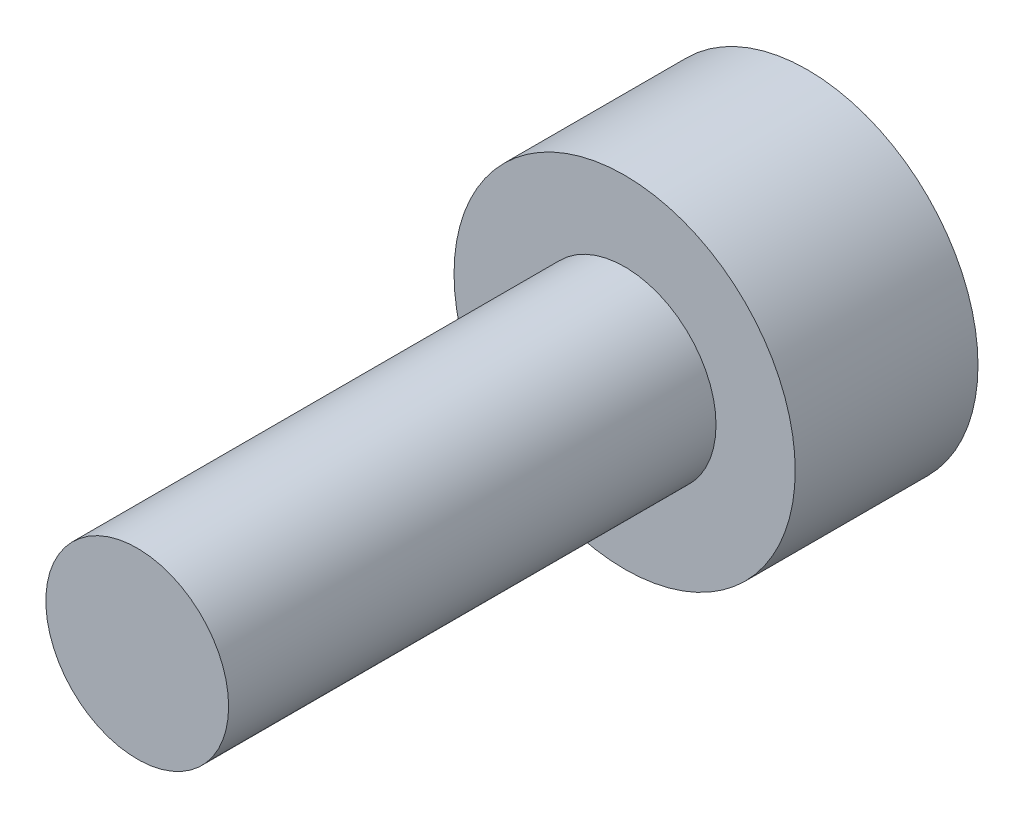
ISO-10303-21;
HEADER;
FILE_DESCRIPTION(('STEP AP214'),'2;1');
FILE_NAME('part.step','',(''),(''),'','','');
FILE_SCHEMA(('AUTOMOTIVE_DESIGN { 1 0 10303 214 1 1 1 1 }'));
ENDSEC;
DATA;
#1=APPLICATION_CONTEXT('core data for automotive mechanical design processes');
#2=APPLICATION_PROTOCOL_DEFINITION('international standard','automotive_design',2000,#1);
#3=PRODUCT_CONTEXT('',#1,'mechanical');
#4=PRODUCT('Part','Part','',(#3));
#5=PRODUCT_RELATED_PRODUCT_CATEGORY('part','',(#4));
#6=PRODUCT_DEFINITION_FORMATION('','',#4);
#7=PRODUCT_DEFINITION_CONTEXT('part definition',#1,'design');
#8=PRODUCT_DEFINITION('design','',#6,#7);
#9=PRODUCT_DEFINITION_SHAPE('','',#8);
#10=(LENGTH_UNIT() NAMED_UNIT(*) SI_UNIT(.MILLI.,.METRE.));
#11=(NAMED_UNIT(*) PLANE_ANGLE_UNIT() SI_UNIT($,.RADIAN.));
#12=(NAMED_UNIT(*) SI_UNIT($,.STERADIAN.) SOLID_ANGLE_UNIT());
#13=UNCERTAINTY_MEASURE_WITH_UNIT(LENGTH_MEASURE(1.E-05),#10,'distance_accuracy_value','');
#14=(GEOMETRIC_REPRESENTATION_CONTEXT(3) GLOBAL_UNCERTAINTY_ASSIGNED_CONTEXT((#13)) GLOBAL_UNIT_ASSIGNED_CONTEXT((#10,
#11,#12)) REPRESENTATION_CONTEXT('',''));
#15=CARTESIAN_POINT('',(0.,0.,0.));
#16=DIRECTION('',(0.,0.,1.));
#17=DIRECTION('',(1.,0.,0.));
#18=AXIS2_PLACEMENT_3D('',#15,#16,#17);
#19=CARTESIAN_POINT('',(0.,0.,-3.));
#20=DIRECTION('',(0.,0.,1.));
#21=DIRECTION('',(1.,0.,0.));
#22=AXIS2_PLACEMENT_3D('',#19,#20,#21);
#23=PLANE('',#22);
#24=CARTESIAN_POINT('',(0.,0.,-3.));
#25=DIRECTION('',(0.,0.,1.));
#26=DIRECTION('',(1.,0.,0.));
#27=AXIS2_PLACEMENT_3D('',#24,#25,#26);
#28=CIRCLE('',#27,2.8);
#29=CARTESIAN_POINT('',(2.8,0.,-3.));
#30=VERTEX_POINT('',#29);
#31=EDGE_CURVE('E112',#30,#30,#28,.T.);
#32=ORIENTED_EDGE('',*,*,#31,.F.);
#33=EDGE_LOOP('',(#32));
#34=FACE_BOUND('',#33,.T.);
#35=DIRECTION('',(0.,-1.,0.));
#36=VECTOR('',#35,1.);
#37=CARTESIAN_POINT('',(1.25,0.,-3.));
#38=LINE('',#37,#36);
#39=CARTESIAN_POINT('',(1.25,0.721687836487032,-3.));
#40=VERTEX_POINT('',#39);
#41=CARTESIAN_POINT('',(1.25,-0.721687836487033,-3.));
#42=VERTEX_POINT('',#41);
#43=EDGE_CURVE('E11',#40,#42,#38,.T.);
#44=ORIENTED_EDGE('',*,*,#43,.F.);
#45=DIRECTION('',(0.866025403784439,-0.5,0.));
#46=VECTOR('',#45,1.);
#47=CARTESIAN_POINT('',(0.625,1.08253175473055,-3.));
#48=LINE('',#47,#46);
#49=CARTESIAN_POINT('',(0.,1.44337567297406,-3.));
#50=VERTEX_POINT('',#49);
#51=EDGE_CURVE('E50',#50,#40,#48,.T.);
#52=ORIENTED_EDGE('',*,*,#51,.F.);
#53=DIRECTION('',(0.866025403784439,0.5,0.));
#54=VECTOR('',#53,1.);
#55=CARTESIAN_POINT('',(-0.625,1.08253175473055,-3.));
#56=LINE('',#55,#54);
#57=CARTESIAN_POINT('',(-1.25,0.721687836487032,-3.));
#58=VERTEX_POINT('',#57);
#59=EDGE_CURVE('E132',#58,#50,#56,.T.);
#60=ORIENTED_EDGE('',*,*,#59,.F.);
#61=DIRECTION('',(0.,1.,0.));
#62=VECTOR('',#61,1.);
#63=CARTESIAN_POINT('',(-1.25,0.,-3.));
#64=LINE('',#63,#62);
#65=CARTESIAN_POINT('',(-1.25,-0.721687836487032,-3.));
#66=VERTEX_POINT('',#65);
#67=EDGE_CURVE('E129',#66,#58,#64,.T.);
#68=ORIENTED_EDGE('',*,*,#67,.F.);
#69=DIRECTION('',(-0.866025403784439,0.5,0.));
#70=VECTOR('',#69,1.);
#71=CARTESIAN_POINT('',(-0.625,-1.08253175473055,-3.));
#72=LINE('',#71,#70);
#73=CARTESIAN_POINT('',(0.,-1.44337567297406,-3.));
#74=VERTEX_POINT('',#73);
#75=EDGE_CURVE('E130',#74,#66,#72,.T.);
#76=ORIENTED_EDGE('',*,*,#75,.F.);
#77=DIRECTION('',(-0.866025403784439,-0.5,0.));
#78=VECTOR('',#77,1.);
#79=CARTESIAN_POINT('',(0.624999999999999,-1.08253175473055,-3.));
#80=LINE('',#79,#78);
#81=EDGE_CURVE('E118',#42,#74,#80,.T.);
#82=ORIENTED_EDGE('',*,*,#81,.F.);
#83=EDGE_LOOP('',(#44,#52,#60,#68,#76,#82));
#84=FACE_BOUND('',#83,.T.);
#85=ADVANCED_FACE('F39',(#34,#84),#23,.F.);
#86=CARTESIAN_POINT('',(0.,0.,0.));
#87=DIRECTION('',(0.,0.,-1.));
#88=DIRECTION('',(-1.,0.,0.));
#89=AXIS2_PLACEMENT_3D('',#86,#87,#88);
#90=CYLINDRICAL_SURFACE('',#89,2.8);
#91=CARTESIAN_POINT('',(0.,0.,0.));
#92=DIRECTION('',(0.,0.,1.));
#93=DIRECTION('',(1.,0.,0.));
#94=AXIS2_PLACEMENT_3D('',#91,#92,#93);
#95=CIRCLE('',#94,2.8);
#96=CARTESIAN_POINT('',(2.8,0.,0.));
#97=VERTEX_POINT('',#96);
#98=EDGE_CURVE('E122',#97,#97,#95,.T.);
#99=ORIENTED_EDGE('',*,*,#98,.F.);
#100=EDGE_LOOP('',(#99));
#101=FACE_BOUND('',#100,.T.);
#102=ORIENTED_EDGE('',*,*,#31,.T.);
#103=EDGE_LOOP('',(#102));
#104=FACE_BOUND('',#103,.T.);
#105=ADVANCED_FACE('F41',(#101,#104),#90,.T.);
#106=CARTESIAN_POINT('',(0.,0.,0.));
#107=DIRECTION('',(0.,0.,1.));
#108=DIRECTION('',(1.,0.,0.));
#109=AXIS2_PLACEMENT_3D('',#106,#107,#108);
#110=PLANE('',#109);
#111=CARTESIAN_POINT('',(0.,0.,0.));
#112=DIRECTION('',(0.,0.,1.));
#113=DIRECTION('',(1.,0.,0.));
#114=AXIS2_PLACEMENT_3D('',#111,#112,#113);
#115=CIRCLE('',#114,1.5);
#116=CARTESIAN_POINT('',(1.5,0.,0.));
#117=VERTEX_POINT('',#116);
#118=EDGE_CURVE('E120',#117,#117,#115,.T.);
#119=ORIENTED_EDGE('',*,*,#118,.F.);
#120=EDGE_LOOP('',(#119));
#121=FACE_BOUND('',#120,.T.);
#122=ORIENTED_EDGE('',*,*,#98,.T.);
#123=EDGE_LOOP('',(#122));
#124=FACE_BOUND('',#123,.T.);
#125=ADVANCED_FACE('F179',(#121,#124),#110,.T.);
#126=CARTESIAN_POINT('',(0.,0.,8.));
#127=DIRECTION('',(0.,0.,-1.));
#128=DIRECTION('',(-1.,0.,0.));
#129=AXIS2_PLACEMENT_3D('',#126,#127,#128);
#130=CYLINDRICAL_SURFACE('',#129,1.5);
#131=CARTESIAN_POINT('',(0.,0.,8.));
#132=DIRECTION('',(0.,0.,1.));
#133=DIRECTION('',(1.,0.,0.));
#134=AXIS2_PLACEMENT_3D('',#131,#132,#133);
#135=CIRCLE('',#134,1.5);
#136=CARTESIAN_POINT('',(1.5,0.,8.));
#137=VERTEX_POINT('',#136);
#138=EDGE_CURVE('E110',#137,#137,#135,.T.);
#139=ORIENTED_EDGE('',*,*,#138,.F.);
#140=EDGE_LOOP('',(#139));
#141=FACE_BOUND('',#140,.T.);
#142=ORIENTED_EDGE('',*,*,#118,.T.);
#143=EDGE_LOOP('',(#142));
#144=FACE_BOUND('',#143,.T.);
#145=ADVANCED_FACE('F184',(#141,#144),#130,.T.);
#146=CARTESIAN_POINT('',(0.,0.,8.));
#147=DIRECTION('',(0.,0.,1.));
#148=DIRECTION('',(1.,0.,0.));
#149=AXIS2_PLACEMENT_3D('',#146,#147,#148);
#150=PLANE('',#149);
#151=ORIENTED_EDGE('',*,*,#138,.T.);
#152=EDGE_LOOP('',(#151));
#153=FACE_BOUND('',#152,.T.);
#154=ADVANCED_FACE('F189',(#153),#150,.T.);
#155=CARTESIAN_POINT('',(1.25,-0.721687836487033,-1.4));
#156=DIRECTION('',(-1.,0.,0.));
#157=DIRECTION('',(0.,-1.,0.));
#158=AXIS2_PLACEMENT_3D('',#155,#156,#157);
#159=PLANE('',#158);
#160=ORIENTED_EDGE('',*,*,#43,.T.);
#161=DIRECTION('',(0.,0.,-1.));
#162=VECTOR('',#161,1.);
#163=CARTESIAN_POINT('',(1.25,-0.721687836487033,-1.4));
#164=LINE('',#163,#162);
#165=CARTESIAN_POINT('',(1.25,-0.721687836487033,-1.4));
#166=VERTEX_POINT('',#165);
#167=EDGE_CURVE('E53',#166,#42,#164,.T.);
#168=ORIENTED_EDGE('',*,*,#167,.F.);
#169=DIRECTION('',(0.,1.,0.));
#170=VECTOR('',#169,1.);
#171=CARTESIAN_POINT('',(1.25,-0.721687836487033,-1.4));
#172=LINE('',#171,#170);
#173=CARTESIAN_POINT('',(1.25,0.721687836487032,-1.4));
#174=VERTEX_POINT('',#173);
#175=EDGE_CURVE('E96',#166,#174,#172,.T.);
#176=ORIENTED_EDGE('',*,*,#175,.T.);
#177=DIRECTION('',(0.,0.,-1.));
#178=VECTOR('',#177,1.);
#179=CARTESIAN_POINT('',(1.25,0.721687836487032,-1.4));
#180=LINE('',#179,#178);
#181=EDGE_CURVE('E103',#174,#40,#180,.T.);
#182=ORIENTED_EDGE('',*,*,#181,.T.);
#183=EDGE_LOOP('',(#160,#168,#176,#182));
#184=FACE_BOUND('',#183,.T.);
#185=ADVANCED_FACE('F105',(#184),#159,.T.);
#186=CARTESIAN_POINT('',(1.25,0.721687836487032,-1.4));
#187=DIRECTION('',(-0.5,-0.866025403784439,0.));
#188=DIRECTION('',(0.866025403784439,-0.5,0.));
#189=AXIS2_PLACEMENT_3D('',#186,#187,#188);
#190=PLANE('',#189);
#191=ORIENTED_EDGE('',*,*,#51,.T.);
#192=ORIENTED_EDGE('',*,*,#181,.F.);
#193=DIRECTION('',(-0.866025403784439,0.5,0.));
#194=VECTOR('',#193,1.);
#195=CARTESIAN_POINT('',(1.25,0.721687836487032,-1.4));
#196=LINE('',#195,#194);
#197=CARTESIAN_POINT('',(0.,1.44337567297406,-1.4));
#198=VERTEX_POINT('',#197);
#199=EDGE_CURVE('E95',#174,#198,#196,.T.);
#200=ORIENTED_EDGE('',*,*,#199,.T.);
#201=DIRECTION('',(0.,0.,-1.));
#202=VECTOR('',#201,1.);
#203=CARTESIAN_POINT('',(0.,1.44337567297406,-1.4));
#204=LINE('',#203,#202);
#205=EDGE_CURVE('E107',#198,#50,#204,.T.);
#206=ORIENTED_EDGE('',*,*,#205,.T.);
#207=EDGE_LOOP('',(#191,#192,#200,#206));
#208=FACE_BOUND('',#207,.T.);
#209=ADVANCED_FACE('F106',(#208),#190,.T.);
#210=CARTESIAN_POINT('',(0.,1.44337567297406,-1.4));
#211=DIRECTION('',(0.5,-0.866025403784439,0.));
#212=DIRECTION('',(0.866025403784439,0.5,0.));
#213=AXIS2_PLACEMENT_3D('',#210,#211,#212);
#214=PLANE('',#213);
#215=ORIENTED_EDGE('',*,*,#59,.T.);
#216=ORIENTED_EDGE('',*,*,#205,.F.);
#217=DIRECTION('',(-0.866025403784439,-0.5,0.));
#218=VECTOR('',#217,1.);
#219=CARTESIAN_POINT('',(0.,1.44337567297406,-1.4));
#220=LINE('',#219,#218);
#221=CARTESIAN_POINT('',(-1.25,0.721687836487032,-1.4));
#222=VERTEX_POINT('',#221);
#223=EDGE_CURVE('E98',#198,#222,#220,.T.);
#224=ORIENTED_EDGE('',*,*,#223,.T.);
#225=DIRECTION('',(0.,0.,-1.));
#226=VECTOR('',#225,1.);
#227=CARTESIAN_POINT('',(-1.25,0.721687836487032,-1.4));
#228=LINE('',#227,#226);
#229=EDGE_CURVE('E114',#222,#58,#228,.T.);
#230=ORIENTED_EDGE('',*,*,#229,.T.);
#231=EDGE_LOOP('',(#215,#216,#224,#230));
#232=FACE_BOUND('',#231,.T.);
#233=ADVANCED_FACE('F133',(#232),#214,.T.);
#234=CARTESIAN_POINT('',(-1.25,0.721687836487032,-1.4));
#235=DIRECTION('',(1.,0.,0.));
#236=DIRECTION('',(0.,1.,0.));
#237=AXIS2_PLACEMENT_3D('',#234,#235,#236);
#238=PLANE('',#237);
#239=ORIENTED_EDGE('',*,*,#67,.T.);
#240=ORIENTED_EDGE('',*,*,#229,.F.);
#241=DIRECTION('',(0.,-1.,0.));
#242=VECTOR('',#241,1.);
#243=CARTESIAN_POINT('',(-1.25,0.721687836487032,-1.4));
#244=LINE('',#243,#242);
#245=CARTESIAN_POINT('',(-1.25,-0.721687836487032,-1.4));
#246=VERTEX_POINT('',#245);
#247=EDGE_CURVE('E157',#222,#246,#244,.T.);
#248=ORIENTED_EDGE('',*,*,#247,.T.);
#249=DIRECTION('',(0.,0.,-1.));
#250=VECTOR('',#249,1.);
#251=CARTESIAN_POINT('',(-1.25,-0.721687836487032,-1.4));
#252=LINE('',#251,#250);
#253=EDGE_CURVE('E151',#246,#66,#252,.T.);
#254=ORIENTED_EDGE('',*,*,#253,.T.);
#255=EDGE_LOOP('',(#239,#240,#248,#254));
#256=FACE_BOUND('',#255,.T.);
#257=ADVANCED_FACE('F165',(#256),#238,.T.);
#258=CARTESIAN_POINT('',(-1.25,-0.721687836487032,-1.4));
#259=DIRECTION('',(0.5,0.866025403784439,0.));
#260=DIRECTION('',(-0.866025403784439,0.5,0.));
#261=AXIS2_PLACEMENT_3D('',#258,#259,#260);
#262=PLANE('',#261);
#263=ORIENTED_EDGE('',*,*,#75,.T.);
#264=ORIENTED_EDGE('',*,*,#253,.F.);
#265=DIRECTION('',(0.866025403784439,-0.5,0.));
#266=VECTOR('',#265,1.);
#267=CARTESIAN_POINT('',(-1.25,-0.721687836487032,-1.4));
#268=LINE('',#267,#266);
#269=CARTESIAN_POINT('',(0.,-1.44337567297406,-1.4));
#270=VERTEX_POINT('',#269);
#271=EDGE_CURVE('E147',#246,#270,#268,.T.);
#272=ORIENTED_EDGE('',*,*,#271,.T.);
#273=DIRECTION('',(0.,0.,-1.));
#274=VECTOR('',#273,1.);
#275=CARTESIAN_POINT('',(0.,-1.44337567297406,-1.4));
#276=LINE('',#275,#274);
#277=EDGE_CURVE('E145',#270,#74,#276,.T.);
#278=ORIENTED_EDGE('',*,*,#277,.T.);
#279=EDGE_LOOP('',(#263,#264,#272,#278));
#280=FACE_BOUND('',#279,.T.);
#281=ADVANCED_FACE('F148',(#280),#262,.T.);
#282=CARTESIAN_POINT('',(0.,-1.44337567297406,-1.4));
#283=DIRECTION('',(-0.5,0.866025403784439,0.));
#284=DIRECTION('',(-0.866025403784439,-0.5,0.));
#285=AXIS2_PLACEMENT_3D('',#282,#283,#284);
#286=PLANE('',#285);
#287=ORIENTED_EDGE('',*,*,#81,.T.);
#288=ORIENTED_EDGE('',*,*,#277,.F.);
#289=DIRECTION('',(0.866025403784439,0.5,0.));
#290=VECTOR('',#289,1.);
#291=CARTESIAN_POINT('',(0.,-1.44337567297406,-1.4));
#292=LINE('',#291,#290);
#293=EDGE_CURVE('E152',#270,#166,#292,.T.);
#294=ORIENTED_EDGE('',*,*,#293,.T.);
#295=ORIENTED_EDGE('',*,*,#167,.T.);
#296=EDGE_LOOP('',(#287,#288,#294,#295));
#297=FACE_BOUND('',#296,.T.);
#298=ADVANCED_FACE('F141',(#297),#286,.T.);
#299=CARTESIAN_POINT('',(0.,0.,-1.4));
#300=DIRECTION('',(0.,0.,1.));
#301=DIRECTION('',(1.,0.,0.));
#302=AXIS2_PLACEMENT_3D('',#299,#300,#301);
#303=PLANE('',#302);
#304=ORIENTED_EDGE('',*,*,#175,.F.);
#305=ORIENTED_EDGE('',*,*,#293,.F.);
#306=ORIENTED_EDGE('',*,*,#271,.F.);
#307=ORIENTED_EDGE('',*,*,#247,.F.);
#308=ORIENTED_EDGE('',*,*,#223,.F.);
#309=ORIENTED_EDGE('',*,*,#199,.F.);
#310=EDGE_LOOP('',(#304,#305,#306,#307,#308,#309));
#311=FACE_BOUND('',#310,.T.);
#312=ADVANCED_FACE('F94',(#311),#303,.F.);
#313=CLOSED_SHELL('',(#85,#105,#125,#145,#154,#185,#209,#233,#257,#281,#298,#312));
#314=MANIFOLD_SOLID_BREP('B2',#313);
#315=ADVANCED_BREP_SHAPE_REPRESENTATION('',(#18,#314),#14);
#316=SHAPE_DEFINITION_REPRESENTATION(#9,#315);
ENDSEC;
END-ISO-10303-21;
